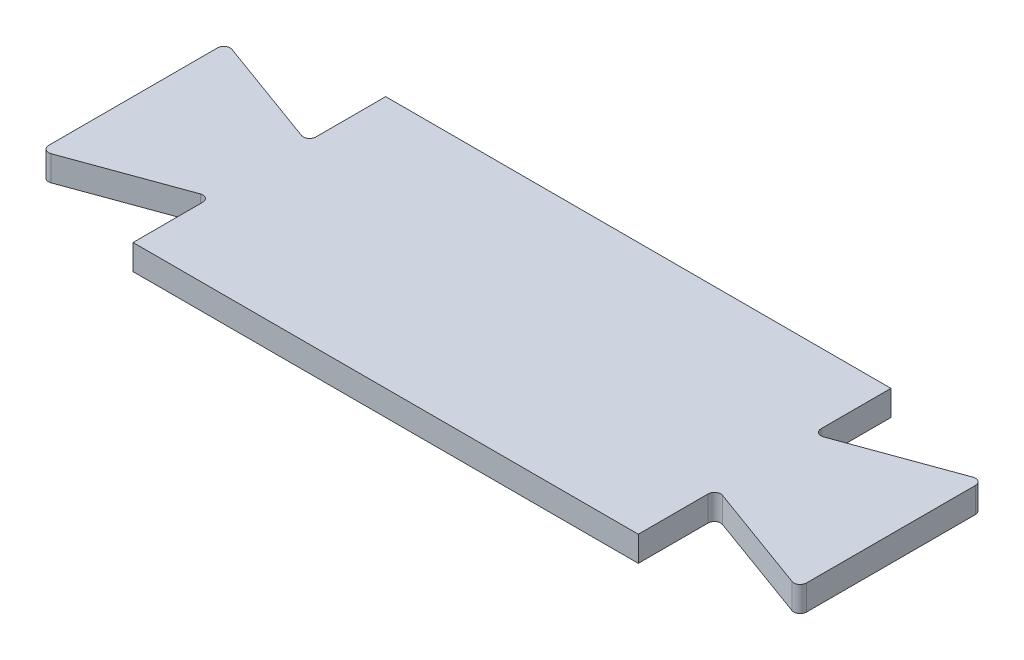
ISO-10303-21;
HEADER;
FILE_DESCRIPTION(('STEP AP214'),'2;1');
FILE_NAME('part.step','',(''),(''),'','','');
FILE_SCHEMA(('AUTOMOTIVE_DESIGN { 1 0 10303 214 1 1 1 1 }'));
ENDSEC;
DATA;
#1=APPLICATION_CONTEXT('core data for automotive mechanical design processes');
#2=APPLICATION_PROTOCOL_DEFINITION('international standard','automotive_design',2000,#1);
#3=PRODUCT_CONTEXT('',#1,'mechanical');
#4=PRODUCT('Part','Part','',(#3));
#5=PRODUCT_RELATED_PRODUCT_CATEGORY('part','',(#4));
#6=PRODUCT_DEFINITION_FORMATION('','',#4);
#7=PRODUCT_DEFINITION_CONTEXT('part definition',#1,'design');
#8=PRODUCT_DEFINITION('design','',#6,#7);
#9=PRODUCT_DEFINITION_SHAPE('','',#8);
#10=(LENGTH_UNIT() NAMED_UNIT(*) SI_UNIT(.MILLI.,.METRE.));
#11=(NAMED_UNIT(*) PLANE_ANGLE_UNIT() SI_UNIT($,.RADIAN.));
#12=(NAMED_UNIT(*) SI_UNIT($,.STERADIAN.) SOLID_ANGLE_UNIT());
#13=UNCERTAINTY_MEASURE_WITH_UNIT(LENGTH_MEASURE(1.E-05),#10,'distance_accuracy_value','');
#14=(GEOMETRIC_REPRESENTATION_CONTEXT(3) GLOBAL_UNCERTAINTY_ASSIGNED_CONTEXT((#13)) GLOBAL_UNIT_ASSIGNED_CONTEXT((#10,
#11,#12)) REPRESENTATION_CONTEXT('',''));
#15=CARTESIAN_POINT('',(0.,0.,0.));
#16=DIRECTION('',(0.,0.,1.));
#17=DIRECTION('',(1.,0.,0.));
#18=AXIS2_PLACEMENT_3D('',#15,#16,#17);
#19=CARTESIAN_POINT('',(10.,1.,-1.88014882866897));
#20=DIRECTION('',(-1.,0.,0.));
#21=DIRECTION('',(0.,0.,1.));
#22=AXIS2_PLACEMENT_3D('',#19,#20,#21);
#23=PLANE('',#22);
#24=DIRECTION('',(0.,0.,-1.));
#25=VECTOR('',#24,1.);
#26=CARTESIAN_POINT('',(10.,1.,-1.88014882866897));
#27=LINE('',#26,#25);
#28=CARTESIAN_POINT('',(10.,1.,-2.2371858303545));
#29=VERTEX_POINT('',#28);
#30=CARTESIAN_POINT('',(10.,1.,-5.));
#31=VERTEX_POINT('',#30);
#32=EDGE_CURVE('E169',#29,#31,#27,.T.);
#33=ORIENTED_EDGE('',*,*,#32,.F.);
#34=DIRECTION('',(0.,-1.,0.));
#35=VECTOR('',#34,1.);
#36=CARTESIAN_POINT('',(10.,0.,-2.2371858303545));
#37=LINE('',#36,#35);
#38=CARTESIAN_POINT('',(10.,0.,-2.2371858303545));
#39=VERTEX_POINT('',#38);
#40=EDGE_CURVE('E236',#29,#39,#37,.T.);
#41=ORIENTED_EDGE('',*,*,#40,.T.);
#42=DIRECTION('',(0.,0.,-1.));
#43=VECTOR('',#42,1.);
#44=CARTESIAN_POINT('',(10.,0.,-1.88014882866897));
#45=LINE('',#44,#43);
#46=CARTESIAN_POINT('',(10.,0.,-5.));
#47=VERTEX_POINT('',#46);
#48=EDGE_CURVE('E194',#39,#47,#45,.T.);
#49=ORIENTED_EDGE('',*,*,#48,.T.);
#50=DIRECTION('',(0.,-1.,0.));
#51=VECTOR('',#50,1.);
#52=CARTESIAN_POINT('',(10.,1.,-5.));
#53=LINE('',#52,#51);
#54=EDGE_CURVE('E187',#31,#47,#53,.T.);
#55=ORIENTED_EDGE('',*,*,#54,.F.);
#56=EDGE_LOOP('',(#33,#41,#49,#55));
#57=FACE_BOUND('',#56,.T.);
#58=ADVANCED_FACE('F33',(#57),#23,.F.);
#59=CARTESIAN_POINT('',(-10.,1.,-5.));
#60=DIRECTION('',(0.,0.,1.));
#61=DIRECTION('',(1.,0.,0.));
#62=AXIS2_PLACEMENT_3D('',#59,#60,#61);
#63=PLANE('',#62);
#64=DIRECTION('',(-1.,0.,0.));
#65=VECTOR('',#64,1.);
#66=CARTESIAN_POINT('',(-10.,0.,-5.));
#67=LINE('',#66,#65);
#68=CARTESIAN_POINT('',(-10.,0.,-5.));
#69=VERTEX_POINT('',#68);
#70=EDGE_CURVE('E305',#47,#69,#67,.T.);
#71=ORIENTED_EDGE('',*,*,#70,.T.);
#72=DIRECTION('',(0.,-1.,0.));
#73=VECTOR('',#72,1.);
#74=CARTESIAN_POINT('',(-10.,1.,-5.));
#75=LINE('',#74,#73);
#76=CARTESIAN_POINT('',(-10.,1.,-5.));
#77=VERTEX_POINT('',#76);
#78=EDGE_CURVE('E189',#77,#69,#75,.T.);
#79=ORIENTED_EDGE('',*,*,#78,.F.);
#80=DIRECTION('',(-1.,0.,0.));
#81=VECTOR('',#80,1.);
#82=CARTESIAN_POINT('',(-10.,1.,-5.));
#83=LINE('',#82,#81);
#84=EDGE_CURVE('E174',#31,#77,#83,.T.);
#85=ORIENTED_EDGE('',*,*,#84,.F.);
#86=ORIENTED_EDGE('',*,*,#54,.T.);
#87=EDGE_LOOP('',(#71,#79,#85,#86));
#88=FACE_BOUND('',#87,.T.);
#89=ADVANCED_FACE('F186',(#88),#63,.F.);
#90=CARTESIAN_POINT('',(-10.,1.,-1.88014882866897));
#91=DIRECTION('',(1.,0.,0.));
#92=DIRECTION('',(0.,0.,-1.));
#93=AXIS2_PLACEMENT_3D('',#90,#91,#92);
#94=PLANE('',#93);
#95=DIRECTION('',(0.,0.,1.));
#96=VECTOR('',#95,1.);
#97=CARTESIAN_POINT('',(-10.,0.,-1.88014882866897));
#98=LINE('',#97,#96);
#99=CARTESIAN_POINT('',(-10.,0.,-2.2371858303545));
#100=VERTEX_POINT('',#99);
#101=EDGE_CURVE('E307',#69,#100,#98,.T.);
#102=ORIENTED_EDGE('',*,*,#101,.T.);
#103=DIRECTION('',(0.,-1.,0.));
#104=VECTOR('',#103,1.);
#105=CARTESIAN_POINT('',(-10.,1.,-2.2371858303545));
#106=LINE('',#105,#104);
#107=CARTESIAN_POINT('',(-10.,1.,-2.2371858303545));
#108=VERTEX_POINT('',#107);
#109=EDGE_CURVE('E234',#100,#108,#106,.F.);
#110=ORIENTED_EDGE('',*,*,#109,.T.);
#111=DIRECTION('',(0.,0.,1.));
#112=VECTOR('',#111,1.);
#113=CARTESIAN_POINT('',(-10.,1.,-1.88014882866897));
#114=LINE('',#113,#112);
#115=EDGE_CURVE('E191',#77,#108,#114,.T.);
#116=ORIENTED_EDGE('',*,*,#115,.F.);
#117=ORIENTED_EDGE('',*,*,#78,.T.);
#118=EDGE_LOOP('',(#102,#110,#116,#117));
#119=FACE_BOUND('',#118,.T.);
#120=ADVANCED_FACE('F393',(#119),#94,.F.);
#121=CARTESIAN_POINT('',(-10.,1.,-1.88014882866897));
#122=DIRECTION('',(-0.342020143325673,0.,0.939692620785907));
#123=DIRECTION('',(0.939692620785907,0.,0.342020143325673));
#124=AXIS2_PLACEMENT_3D('',#121,#122,#123);
#125=PLANE('',#124);
#126=DIRECTION('',(-0.939692620785907,0.,-0.342020143325673));
#127=VECTOR('',#126,1.);
#128=CARTESIAN_POINT('',(-10.,0.,-1.88014882866897));
#129=LINE('',#128,#127);
#130=CARTESIAN_POINT('',(-10.3355050358314,0.,-2.00226267515802));
#131=VERTEX_POINT('',#130);
#132=CARTESIAN_POINT('',(-14.6644949641686,0.,-3.57788615351095));
#133=VERTEX_POINT('',#132);
#134=EDGE_CURVE('E310',#131,#133,#129,.T.);
#135=ORIENTED_EDGE('',*,*,#134,.T.);
#136=DIRECTION('',(0.,-1.,0.));
#137=VECTOR('',#136,1.);
#138=CARTESIAN_POINT('',(-14.6644949641686,1.,-3.57788615351095));
#139=LINE('',#138,#137);
#140=CARTESIAN_POINT('',(-14.6644949641686,1.,-3.57788615351095));
#141=VERTEX_POINT('',#140);
#142=EDGE_CURVE('E232',#133,#141,#139,.F.);
#143=ORIENTED_EDGE('',*,*,#142,.T.);
#144=DIRECTION('',(-0.939692620785907,0.,-0.342020143325673));
#145=VECTOR('',#144,1.);
#146=CARTESIAN_POINT('',(-10.,1.,-1.88014882866897));
#147=LINE('',#146,#145);
#148=CARTESIAN_POINT('',(-10.3355050358314,1.,-2.00226267515802));
#149=VERTEX_POINT('',#148);
#150=EDGE_CURVE('E352',#149,#141,#147,.T.);
#151=ORIENTED_EDGE('',*,*,#150,.F.);
#152=DIRECTION('',(0.,-1.,0.));
#153=VECTOR('',#152,1.);
#154=CARTESIAN_POINT('',(-10.3355050358314,0.,-2.00226267515802));
#155=LINE('',#154,#153);
#156=EDGE_CURVE('E229',#149,#131,#155,.T.);
#157=ORIENTED_EDGE('',*,*,#156,.T.);
#158=EDGE_LOOP('',(#135,#143,#151,#157));
#159=FACE_BOUND('',#158,.T.);
#160=ADVANCED_FACE('F366',(#159),#125,.F.);
#161=CARTESIAN_POINT('',(-15.,1.,-3.7));
#162=DIRECTION('',(1.,0.,0.));
#163=DIRECTION('',(0.,0.,-1.));
#164=AXIS2_PLACEMENT_3D('',#161,#162,#163);
#165=PLANE('',#164);
#166=DIRECTION('',(0.,0.,1.));
#167=VECTOR('',#166,1.);
#168=CARTESIAN_POINT('',(-15.,0.,-3.7));
#169=LINE('',#168,#167);
#170=CARTESIAN_POINT('',(-15.,0.,-3.34296299831447));
#171=VERTEX_POINT('',#170);
#172=CARTESIAN_POINT('',(-15.,0.,3.34296299831447));
#173=VERTEX_POINT('',#172);
#174=EDGE_CURVE('E313',#171,#173,#169,.T.);
#175=ORIENTED_EDGE('',*,*,#174,.T.);
#176=DIRECTION('',(0.,-1.,0.));
#177=VECTOR('',#176,1.);
#178=CARTESIAN_POINT('',(-15.,1.,3.34296299831447));
#179=LINE('',#178,#177);
#180=CARTESIAN_POINT('',(-15.,1.,3.34296299831447));
#181=VERTEX_POINT('',#180);
#182=EDGE_CURVE('E220',#173,#181,#179,.F.);
#183=ORIENTED_EDGE('',*,*,#182,.T.);
#184=DIRECTION('',(0.,0.,1.));
#185=VECTOR('',#184,1.);
#186=CARTESIAN_POINT('',(-15.,1.,-3.7));
#187=LINE('',#186,#185);
#188=CARTESIAN_POINT('',(-15.,1.,-3.34296299831447));
#189=VERTEX_POINT('',#188);
#190=EDGE_CURVE('E349',#189,#181,#187,.T.);
#191=ORIENTED_EDGE('',*,*,#190,.F.);
#192=DIRECTION('',(0.,-1.,0.));
#193=VECTOR('',#192,1.);
#194=CARTESIAN_POINT('',(-15.,1.,-3.34296299831447));
#195=LINE('',#194,#193);
#196=EDGE_CURVE('E217',#189,#171,#195,.T.);
#197=ORIENTED_EDGE('',*,*,#196,.T.);
#198=EDGE_LOOP('',(#175,#183,#191,#197));
#199=FACE_BOUND('',#198,.T.);
#200=ADVANCED_FACE('F376',(#199),#165,.F.);
#201=CARTESIAN_POINT('',(-10.,1.,1.88014882866896));
#202=DIRECTION('',(-0.342020143325673,0.,-0.939692620785907));
#203=DIRECTION('',(-0.939692620785907,0.,0.342020143325673));
#204=AXIS2_PLACEMENT_3D('',#201,#202,#203);
#205=PLANE('',#204);
#206=DIRECTION('',(0.939692620785907,0.,-0.342020143325673));
#207=VECTOR('',#206,1.);
#208=CARTESIAN_POINT('',(-10.,0.,1.88014882866896));
#209=LINE('',#208,#207);
#210=CARTESIAN_POINT('',(-14.6644949641686,0.,3.57788615351095));
#211=VERTEX_POINT('',#210);
#212=CARTESIAN_POINT('',(-10.3355050358314,0.,2.00226267515802));
#213=VERTEX_POINT('',#212);
#214=EDGE_CURVE('E316',#211,#213,#209,.T.);
#215=ORIENTED_EDGE('',*,*,#214,.T.);
#216=DIRECTION('',(0.,-1.,0.));
#217=VECTOR('',#216,1.);
#218=CARTESIAN_POINT('',(-10.3355050358314,1.,2.00226267515802));
#219=LINE('',#218,#217);
#220=CARTESIAN_POINT('',(-10.3355050358314,1.,2.00226267515802));
#221=VERTEX_POINT('',#220);
#222=EDGE_CURVE('E207',#213,#221,#219,.F.);
#223=ORIENTED_EDGE('',*,*,#222,.T.);
#224=DIRECTION('',(0.939692620785907,0.,-0.342020143325673));
#225=VECTOR('',#224,1.);
#226=CARTESIAN_POINT('',(-10.,1.,1.88014882866896));
#227=LINE('',#226,#225);
#228=CARTESIAN_POINT('',(-14.6644949641686,1.,3.57788615351095));
#229=VERTEX_POINT('',#228);
#230=EDGE_CURVE('E346',#229,#221,#227,.T.);
#231=ORIENTED_EDGE('',*,*,#230,.F.);
#232=DIRECTION('',(0.,-1.,0.));
#233=VECTOR('',#232,1.);
#234=CARTESIAN_POINT('',(-14.6644949641686,1.,3.57788615351095));
#235=LINE('',#234,#233);
#236=EDGE_CURVE('E199',#229,#211,#235,.T.);
#237=ORIENTED_EDGE('',*,*,#236,.T.);
#238=EDGE_LOOP('',(#215,#223,#231,#237));
#239=FACE_BOUND('',#238,.T.);
#240=ADVANCED_FACE('F345',(#239),#205,.F.);
#241=CARTESIAN_POINT('',(-10.,1.,5.));
#242=DIRECTION('',(1.,0.,0.));
#243=DIRECTION('',(0.,0.,-1.));
#244=AXIS2_PLACEMENT_3D('',#241,#242,#243);
#245=PLANE('',#244);
#246=DIRECTION('',(0.,0.,1.));
#247=VECTOR('',#246,1.);
#248=CARTESIAN_POINT('',(-10.,1.,5.));
#249=LINE('',#248,#247);
#250=CARTESIAN_POINT('',(-10.,1.,2.23718583035449));
#251=VERTEX_POINT('',#250);
#252=CARTESIAN_POINT('',(-10.,1.,5.));
#253=VERTEX_POINT('',#252);
#254=EDGE_CURVE('E337',#251,#253,#249,.T.);
#255=ORIENTED_EDGE('',*,*,#254,.F.);
#256=DIRECTION('',(0.,-1.,0.));
#257=VECTOR('',#256,1.);
#258=CARTESIAN_POINT('',(-10.,0.,2.23718583035449));
#259=LINE('',#258,#257);
#260=CARTESIAN_POINT('',(-10.,0.,2.23718583035449));
#261=VERTEX_POINT('',#260);
#262=EDGE_CURVE('E196',#251,#261,#259,.T.);
#263=ORIENTED_EDGE('',*,*,#262,.T.);
#264=DIRECTION('',(0.,0.,1.));
#265=VECTOR('',#264,1.);
#266=CARTESIAN_POINT('',(-10.,0.,5.));
#267=LINE('',#266,#265);
#268=CARTESIAN_POINT('',(-10.,0.,5.));
#269=VERTEX_POINT('',#268);
#270=EDGE_CURVE('E319',#261,#269,#267,.T.);
#271=ORIENTED_EDGE('',*,*,#270,.T.);
#272=DIRECTION('',(0.,-1.,0.));
#273=VECTOR('',#272,1.);
#274=CARTESIAN_POINT('',(-10.,1.,5.));
#275=LINE('',#274,#273);
#276=EDGE_CURVE('E201',#253,#269,#275,.T.);
#277=ORIENTED_EDGE('',*,*,#276,.F.);
#278=EDGE_LOOP('',(#255,#263,#271,#277));
#279=FACE_BOUND('',#278,.T.);
#280=ADVANCED_FACE('F335',(#279),#245,.F.);
#281=CARTESIAN_POINT('',(-10.,1.,5.));
#282=DIRECTION('',(0.,0.,-1.));
#283=DIRECTION('',(-1.,0.,0.));
#284=AXIS2_PLACEMENT_3D('',#281,#282,#283);
#285=PLANE('',#284);
#286=DIRECTION('',(1.,0.,0.));
#287=VECTOR('',#286,1.);
#288=CARTESIAN_POINT('',(-10.,0.,5.));
#289=LINE('',#288,#287);
#290=CARTESIAN_POINT('',(10.,0.,5.));
#291=VERTEX_POINT('',#290);
#292=EDGE_CURVE('E284',#269,#291,#289,.T.);
#293=ORIENTED_EDGE('',*,*,#292,.T.);
#294=DIRECTION('',(0.,-1.,0.));
#295=VECTOR('',#294,1.);
#296=CARTESIAN_POINT('',(10.,1.,5.));
#297=LINE('',#296,#295);
#298=CARTESIAN_POINT('',(10.,1.,5.));
#299=VERTEX_POINT('',#298);
#300=EDGE_CURVE('E283',#299,#291,#297,.T.);
#301=ORIENTED_EDGE('',*,*,#300,.F.);
#302=DIRECTION('',(1.,0.,0.));
#303=VECTOR('',#302,1.);
#304=CARTESIAN_POINT('',(-10.,1.,5.));
#305=LINE('',#304,#303);
#306=EDGE_CURVE('E299',#253,#299,#305,.T.);
#307=ORIENTED_EDGE('',*,*,#306,.F.);
#308=ORIENTED_EDGE('',*,*,#276,.T.);
#309=EDGE_LOOP('',(#293,#301,#307,#308));
#310=FACE_BOUND('',#309,.T.);
#311=ADVANCED_FACE('F331',(#310),#285,.F.);
#312=CARTESIAN_POINT('',(10.,1.,5.));
#313=DIRECTION('',(-1.,0.,0.));
#314=DIRECTION('',(0.,0.,1.));
#315=AXIS2_PLACEMENT_3D('',#312,#313,#314);
#316=PLANE('',#315);
#317=DIRECTION('',(0.,0.,-1.));
#318=VECTOR('',#317,1.);
#319=CARTESIAN_POINT('',(10.,0.,5.));
#320=LINE('',#319,#318);
#321=CARTESIAN_POINT('',(10.,0.,2.23718583035449));
#322=VERTEX_POINT('',#321);
#323=EDGE_CURVE('E271',#291,#322,#320,.T.);
#324=ORIENTED_EDGE('',*,*,#323,.T.);
#325=DIRECTION('',(0.,-1.,0.));
#326=VECTOR('',#325,1.);
#327=CARTESIAN_POINT('',(10.,1.,2.23718583035449));
#328=LINE('',#327,#326);
#329=CARTESIAN_POINT('',(10.,1.,2.23718583035449));
#330=VERTEX_POINT('',#329);
#331=EDGE_CURVE('E252',#322,#330,#328,.F.);
#332=ORIENTED_EDGE('',*,*,#331,.T.);
#333=DIRECTION('',(0.,0.,-1.));
#334=VECTOR('',#333,1.);
#335=CARTESIAN_POINT('',(10.,1.,5.));
#336=LINE('',#335,#334);
#337=EDGE_CURVE('E291',#299,#330,#336,.T.);
#338=ORIENTED_EDGE('',*,*,#337,.F.);
#339=ORIENTED_EDGE('',*,*,#300,.T.);
#340=EDGE_LOOP('',(#324,#332,#338,#339));
#341=FACE_BOUND('',#340,.T.);
#342=ADVANCED_FACE('F279',(#341),#316,.F.);
#343=CARTESIAN_POINT('',(10.,1.,1.88014882866896));
#344=DIRECTION('',(0.342020143325672,0.,-0.939692620785907));
#345=DIRECTION('',(-0.939692620785907,0.,-0.342020143325672));
#346=AXIS2_PLACEMENT_3D('',#343,#344,#345);
#347=PLANE('',#346);
#348=DIRECTION('',(0.939692620785907,0.,0.342020143325672));
#349=VECTOR('',#348,1.);
#350=CARTESIAN_POINT('',(10.,0.,1.88014882866896));
#351=LINE('',#350,#349);
#352=CARTESIAN_POINT('',(10.3355050358314,0.,2.00226267515801));
#353=VERTEX_POINT('',#352);
#354=CARTESIAN_POINT('',(14.6644949641686,0.,3.57788615351094));
#355=VERTEX_POINT('',#354);
#356=EDGE_CURVE('E273',#353,#355,#351,.T.);
#357=ORIENTED_EDGE('',*,*,#356,.T.);
#358=DIRECTION('',(0.,-1.,0.));
#359=VECTOR('',#358,1.);
#360=CARTESIAN_POINT('',(14.6644949641686,1.,3.57788615351094));
#361=LINE('',#360,#359);
#362=CARTESIAN_POINT('',(14.6644949641686,1.,3.57788615351094));
#363=VERTEX_POINT('',#362);
#364=EDGE_CURVE('E250',#355,#363,#361,.F.);
#365=ORIENTED_EDGE('',*,*,#364,.T.);
#366=DIRECTION('',(0.939692620785907,0.,0.342020143325672));
#367=VECTOR('',#366,1.);
#368=CARTESIAN_POINT('',(10.,1.,1.88014882866896));
#369=LINE('',#368,#367);
#370=CARTESIAN_POINT('',(10.3355050358314,1.,2.00226267515801));
#371=VERTEX_POINT('',#370);
#372=EDGE_CURVE('E289',#371,#363,#369,.T.);
#373=ORIENTED_EDGE('',*,*,#372,.F.);
#374=DIRECTION('',(0.,-1.,0.));
#375=VECTOR('',#374,1.);
#376=CARTESIAN_POINT('',(10.3355050358314,0.,2.00226267515801));
#377=LINE('',#376,#375);
#378=EDGE_CURVE('E247',#371,#353,#377,.T.);
#379=ORIENTED_EDGE('',*,*,#378,.T.);
#380=EDGE_LOOP('',(#357,#365,#373,#379));
#381=FACE_BOUND('',#380,.T.);
#382=ADVANCED_FACE('F293',(#381),#347,.F.);
#383=CARTESIAN_POINT('',(15.,1.,-3.70000000000001));
#384=DIRECTION('',(-1.,0.,0.));
#385=DIRECTION('',(0.,0.,1.));
#386=AXIS2_PLACEMENT_3D('',#383,#384,#385);
#387=PLANE('',#386);
#388=DIRECTION('',(0.,0.,-1.));
#389=VECTOR('',#388,1.);
#390=CARTESIAN_POINT('',(15.,0.,-3.70000000000001));
#391=LINE('',#390,#389);
#392=CARTESIAN_POINT('',(15.,0.,3.34296299831446));
#393=VERTEX_POINT('',#392);
#394=CARTESIAN_POINT('',(15.,0.,-3.34296299831448));
#395=VERTEX_POINT('',#394);
#396=EDGE_CURVE('E323',#393,#395,#391,.T.);
#397=ORIENTED_EDGE('',*,*,#396,.T.);
#398=DIRECTION('',(0.,-1.,0.));
#399=VECTOR('',#398,1.);
#400=CARTESIAN_POINT('',(15.,1.,-3.34296299831448));
#401=LINE('',#400,#399);
#402=CARTESIAN_POINT('',(15.,1.,-3.34296299831448));
#403=VERTEX_POINT('',#402);
#404=EDGE_CURVE('E245',#395,#403,#401,.F.);
#405=ORIENTED_EDGE('',*,*,#404,.T.);
#406=DIRECTION('',(0.,0.,-1.));
#407=VECTOR('',#406,1.);
#408=CARTESIAN_POINT('',(15.,1.,-3.70000000000001));
#409=LINE('',#408,#407);
#410=CARTESIAN_POINT('',(15.,1.,3.34296299831446));
#411=VERTEX_POINT('',#410);
#412=EDGE_CURVE('E295',#411,#403,#409,.T.);
#413=ORIENTED_EDGE('',*,*,#412,.F.);
#414=DIRECTION('',(0.,-1.,0.));
#415=VECTOR('',#414,1.);
#416=CARTESIAN_POINT('',(15.,1.,3.34296299831446));
#417=LINE('',#416,#415);
#418=EDGE_CURVE('E242',#411,#393,#417,.T.);
#419=ORIENTED_EDGE('',*,*,#418,.T.);
#420=EDGE_LOOP('',(#397,#405,#413,#419));
#421=FACE_BOUND('',#420,.T.);
#422=ADVANCED_FACE('F412',(#421),#387,.F.);
#423=CARTESIAN_POINT('',(10.,1.,-1.88014882866897));
#424=DIRECTION('',(0.342020143325673,0.,0.939692620785907));
#425=DIRECTION('',(0.939692620785907,0.,-0.342020143325673));
#426=AXIS2_PLACEMENT_3D('',#423,#424,#425);
#427=PLANE('',#426);
#428=DIRECTION('',(-0.939692620785907,0.,0.342020143325673));
#429=VECTOR('',#428,1.);
#430=CARTESIAN_POINT('',(10.,0.,-1.88014882866897));
#431=LINE('',#430,#429);
#432=CARTESIAN_POINT('',(14.6644949641686,0.,-3.57788615351096));
#433=VERTEX_POINT('',#432);
#434=CARTESIAN_POINT('',(10.3355050358314,0.,-2.00226267515803));
#435=VERTEX_POINT('',#434);
#436=EDGE_CURVE('E182',#433,#435,#431,.T.);
#437=ORIENTED_EDGE('',*,*,#436,.T.);
#438=DIRECTION('',(0.,-1.,0.));
#439=VECTOR('',#438,1.);
#440=CARTESIAN_POINT('',(10.3355050358314,1.,-2.00226267515803));
#441=LINE('',#440,#439);
#442=CARTESIAN_POINT('',(10.3355050358314,1.,-2.00226267515803));
#443=VERTEX_POINT('',#442);
#444=EDGE_CURVE('E48',#435,#443,#441,.F.);
#445=ORIENTED_EDGE('',*,*,#444,.T.);
#446=DIRECTION('',(-0.939692620785907,0.,0.342020143325673));
#447=VECTOR('',#446,1.);
#448=CARTESIAN_POINT('',(10.,1.,-1.88014882866897));
#449=LINE('',#448,#447);
#450=CARTESIAN_POINT('',(14.6644949641686,1.,-3.57788615351096));
#451=VERTEX_POINT('',#450);
#452=EDGE_CURVE('E297',#451,#443,#449,.T.);
#453=ORIENTED_EDGE('',*,*,#452,.F.);
#454=DIRECTION('',(0.,-1.,0.));
#455=VECTOR('',#454,1.);
#456=CARTESIAN_POINT('',(14.6644949641686,1.,-3.57788615351096));
#457=LINE('',#456,#455);
#458=EDGE_CURVE('E238',#451,#433,#457,.T.);
#459=ORIENTED_EDGE('',*,*,#458,.T.);
#460=EDGE_LOOP('',(#437,#445,#453,#459));
#461=FACE_BOUND('',#460,.T.);
#462=ADVANCED_FACE('F415',(#461),#427,.F.);
#463=CARTESIAN_POINT('',(0.,1.,0.));
#464=DIRECTION('',(0.,-1.,0.));
#465=DIRECTION('',(0.,0.,-1.));
#466=AXIS2_PLACEMENT_3D('',#463,#464,#465);
#467=PLANE('',#466);
#468=ORIENTED_EDGE('',*,*,#190,.T.);
#469=CARTESIAN_POINT('',(-14.75,1.,3.34296299831447));
#470=DIRECTION('',(0.,-1.,0.));
#471=DIRECTION('',(0.,0.,-1.));
#472=AXIS2_PLACEMENT_3D('',#469,#470,#471);
#473=CIRCLE('',#472,0.25);
#474=EDGE_CURVE('E227',#181,#229,#473,.F.);
#475=ORIENTED_EDGE('',*,*,#474,.T.);
#476=ORIENTED_EDGE('',*,*,#230,.T.);
#477=CARTESIAN_POINT('',(-10.25,1.,2.23718583035449));
#478=DIRECTION('',(0.,-1.,0.));
#479=DIRECTION('',(0.,0.,-1.));
#480=AXIS2_PLACEMENT_3D('',#477,#478,#479);
#481=CIRCLE('',#480,0.25);
#482=EDGE_CURVE('E256',#221,#251,#481,.T.);
#483=ORIENTED_EDGE('',*,*,#482,.T.);
#484=ORIENTED_EDGE('',*,*,#254,.T.);
#485=ORIENTED_EDGE('',*,*,#306,.T.);
#486=ORIENTED_EDGE('',*,*,#337,.T.);
#487=CARTESIAN_POINT('',(10.25,1.,2.23718583035449));
#488=DIRECTION('',(0.,-1.,0.));
#489=DIRECTION('',(0.,0.,-1.));
#490=AXIS2_PLACEMENT_3D('',#487,#488,#489);
#491=CIRCLE('',#490,0.25);
#492=EDGE_CURVE('E11',#330,#371,#491,.T.);
#493=ORIENTED_EDGE('',*,*,#492,.T.);
#494=ORIENTED_EDGE('',*,*,#372,.T.);
#495=CARTESIAN_POINT('',(14.75,1.,3.34296299831446));
#496=DIRECTION('',(0.,-1.,0.));
#497=DIRECTION('',(0.,0.,-1.));
#498=AXIS2_PLACEMENT_3D('',#495,#496,#497);
#499=CIRCLE('',#498,0.25);
#500=EDGE_CURVE('E222',#363,#411,#499,.F.);
#501=ORIENTED_EDGE('',*,*,#500,.T.);
#502=ORIENTED_EDGE('',*,*,#412,.T.);
#503=CARTESIAN_POINT('',(14.75,1.,-3.34296299831448));
#504=DIRECTION('',(0.,-1.,0.));
#505=DIRECTION('',(0.,0.,-1.));
#506=AXIS2_PLACEMENT_3D('',#503,#504,#505);
#507=CIRCLE('',#506,0.25);
#508=EDGE_CURVE('E55',#403,#451,#507,.F.);
#509=ORIENTED_EDGE('',*,*,#508,.T.);
#510=ORIENTED_EDGE('',*,*,#452,.T.);
#511=CARTESIAN_POINT('',(10.25,1.,-2.2371858303545));
#512=DIRECTION('',(0.,-1.,0.));
#513=DIRECTION('',(0.,0.,-1.));
#514=AXIS2_PLACEMENT_3D('',#511,#512,#513);
#515=CIRCLE('',#514,0.25);
#516=EDGE_CURVE('E177',#443,#29,#515,.T.);
#517=ORIENTED_EDGE('',*,*,#516,.T.);
#518=ORIENTED_EDGE('',*,*,#32,.T.);
#519=ORIENTED_EDGE('',*,*,#84,.T.);
#520=ORIENTED_EDGE('',*,*,#115,.T.);
#521=CARTESIAN_POINT('',(-10.25,1.,-2.2371858303545));
#522=DIRECTION('',(0.,-1.,0.));
#523=DIRECTION('',(0.,0.,-1.));
#524=AXIS2_PLACEMENT_3D('',#521,#522,#523);
#525=CIRCLE('',#524,0.25);
#526=EDGE_CURVE('E260',#108,#149,#525,.T.);
#527=ORIENTED_EDGE('',*,*,#526,.T.);
#528=ORIENTED_EDGE('',*,*,#150,.T.);
#529=CARTESIAN_POINT('',(-14.75,1.,-3.34296299831447));
#530=DIRECTION('',(0.,-1.,0.));
#531=DIRECTION('',(0.,0.,-1.));
#532=AXIS2_PLACEMENT_3D('',#529,#530,#531);
#533=CIRCLE('',#532,0.25);
#534=EDGE_CURVE('E225',#141,#189,#533,.F.);
#535=ORIENTED_EDGE('',*,*,#534,.T.);
#536=EDGE_LOOP('',(#468,#475,#476,#483,#484,#485,#486,#493,#494,#501,#502,#509,#510,#517,#518,
#519,#520,#527,#528,#535));
#537=FACE_BOUND('',#536,.T.);
#538=ADVANCED_FACE('F172',(#537),#467,.F.);
#539=CARTESIAN_POINT('',(0.,0.,0.));
#540=DIRECTION('',(0.,-1.,0.));
#541=DIRECTION('',(0.,0.,-1.));
#542=AXIS2_PLACEMENT_3D('',#539,#540,#541);
#543=PLANE('',#542);
#544=ORIENTED_EDGE('',*,*,#214,.F.);
#545=CARTESIAN_POINT('',(-14.75,0.,3.34296299831447));
#546=DIRECTION('',(0.,-1.,0.));
#547=DIRECTION('',(0.,0.,-1.));
#548=AXIS2_PLACEMENT_3D('',#545,#546,#547);
#549=CIRCLE('',#548,0.25);
#550=EDGE_CURVE('E215',#211,#173,#549,.T.);
#551=ORIENTED_EDGE('',*,*,#550,.T.);
#552=ORIENTED_EDGE('',*,*,#174,.F.);
#553=CARTESIAN_POINT('',(-14.75,0.,-3.34296299831447));
#554=DIRECTION('',(0.,-1.,0.));
#555=DIRECTION('',(0.,0.,-1.));
#556=AXIS2_PLACEMENT_3D('',#553,#554,#555);
#557=CIRCLE('',#556,0.25);
#558=EDGE_CURVE('E213',#171,#133,#557,.T.);
#559=ORIENTED_EDGE('',*,*,#558,.T.);
#560=ORIENTED_EDGE('',*,*,#134,.F.);
#561=CARTESIAN_POINT('',(-10.25,0.,-2.2371858303545));
#562=DIRECTION('',(0.,-1.,0.));
#563=DIRECTION('',(0.,0.,-1.));
#564=AXIS2_PLACEMENT_3D('',#561,#562,#563);
#565=CIRCLE('',#564,0.25);
#566=EDGE_CURVE('E258',#131,#100,#565,.F.);
#567=ORIENTED_EDGE('',*,*,#566,.T.);
#568=ORIENTED_EDGE('',*,*,#101,.F.);
#569=ORIENTED_EDGE('',*,*,#70,.F.);
#570=ORIENTED_EDGE('',*,*,#48,.F.);
#571=CARTESIAN_POINT('',(10.25,0.,-2.2371858303545));
#572=DIRECTION('',(0.,-1.,0.));
#573=DIRECTION('',(0.,0.,-1.));
#574=AXIS2_PLACEMENT_3D('',#571,#572,#573);
#575=CIRCLE('',#574,0.25);
#576=EDGE_CURVE('E262',#39,#435,#575,.F.);
#577=ORIENTED_EDGE('',*,*,#576,.T.);
#578=ORIENTED_EDGE('',*,*,#436,.F.);
#579=CARTESIAN_POINT('',(14.75,0.,-3.34296299831448));
#580=DIRECTION('',(0.,-1.,0.));
#581=DIRECTION('',(0.,0.,-1.));
#582=AXIS2_PLACEMENT_3D('',#579,#580,#581);
#583=CIRCLE('',#582,0.25);
#584=EDGE_CURVE('E211',#433,#395,#583,.T.);
#585=ORIENTED_EDGE('',*,*,#584,.T.);
#586=ORIENTED_EDGE('',*,*,#396,.F.);
#587=CARTESIAN_POINT('',(14.75,0.,3.34296299831446));
#588=DIRECTION('',(0.,-1.,0.));
#589=DIRECTION('',(0.,0.,-1.));
#590=AXIS2_PLACEMENT_3D('',#587,#588,#589);
#591=CIRCLE('',#590,0.25);
#592=EDGE_CURVE('E209',#393,#355,#591,.T.);
#593=ORIENTED_EDGE('',*,*,#592,.T.);
#594=ORIENTED_EDGE('',*,*,#356,.F.);
#595=CARTESIAN_POINT('',(10.25,0.,2.23718583035449));
#596=DIRECTION('',(0.,-1.,0.));
#597=DIRECTION('',(0.,0.,-1.));
#598=AXIS2_PLACEMENT_3D('',#595,#596,#597);
#599=CIRCLE('',#598,0.25);
#600=EDGE_CURVE('E41',#353,#322,#599,.F.);
#601=ORIENTED_EDGE('',*,*,#600,.T.);
#602=ORIENTED_EDGE('',*,*,#323,.F.);
#603=ORIENTED_EDGE('',*,*,#292,.F.);
#604=ORIENTED_EDGE('',*,*,#270,.F.);
#605=CARTESIAN_POINT('',(-10.25,0.,2.23718583035449));
#606=DIRECTION('',(0.,-1.,0.));
#607=DIRECTION('',(0.,0.,-1.));
#608=AXIS2_PLACEMENT_3D('',#605,#606,#607);
#609=CIRCLE('',#608,0.25);
#610=EDGE_CURVE('E254',#261,#213,#609,.F.);
#611=ORIENTED_EDGE('',*,*,#610,.T.);
#612=EDGE_LOOP('',(#544,#551,#552,#559,#560,#567,#568,#569,#570,#577,#578,#585,#586,#593,#594,
#601,#602,#603,#604,#611));
#613=FACE_BOUND('',#612,.T.);
#614=ADVANCED_FACE('F269',(#613),#543,.T.);
#615=CARTESIAN_POINT('',(-10.25,1.,2.23718583035449));
#616=DIRECTION('',(0.,1.,0.));
#617=DIRECTION('',(0.,0.,1.));
#618=AXIS2_PLACEMENT_3D('',#615,#616,#617);
#619=CYLINDRICAL_SURFACE('',#618,0.25);
#620=ORIENTED_EDGE('',*,*,#482,.F.);
#621=ORIENTED_EDGE('',*,*,#222,.F.);
#622=ORIENTED_EDGE('',*,*,#610,.F.);
#623=ORIENTED_EDGE('',*,*,#262,.F.);
#624=EDGE_LOOP('',(#620,#621,#622,#623));
#625=FACE_BOUND('',#624,.T.);
#626=ADVANCED_FACE('F340',(#625),#619,.F.);
#627=CARTESIAN_POINT('',(-14.75,1.,3.34296299831447));
#628=DIRECTION('',(0.,-1.,0.));
#629=DIRECTION('',(0.,0.,-1.));
#630=AXIS2_PLACEMENT_3D('',#627,#628,#629);
#631=CYLINDRICAL_SURFACE('',#630,0.25);
#632=ORIENTED_EDGE('',*,*,#474,.F.);
#633=ORIENTED_EDGE('',*,*,#182,.F.);
#634=ORIENTED_EDGE('',*,*,#550,.F.);
#635=ORIENTED_EDGE('',*,*,#236,.F.);
#636=EDGE_LOOP('',(#632,#633,#634,#635));
#637=FACE_BOUND('',#636,.T.);
#638=ADVANCED_FACE('F379',(#637),#631,.T.);
#639=CARTESIAN_POINT('',(-14.75,1.,-3.34296299831447));
#640=DIRECTION('',(0.,-1.,0.));
#641=DIRECTION('',(0.,0.,-1.));
#642=AXIS2_PLACEMENT_3D('',#639,#640,#641);
#643=CYLINDRICAL_SURFACE('',#642,0.25);
#644=ORIENTED_EDGE('',*,*,#534,.F.);
#645=ORIENTED_EDGE('',*,*,#142,.F.);
#646=ORIENTED_EDGE('',*,*,#558,.F.);
#647=ORIENTED_EDGE('',*,*,#196,.F.);
#648=EDGE_LOOP('',(#644,#645,#646,#647));
#649=FACE_BOUND('',#648,.T.);
#650=ADVANCED_FACE('F373',(#649),#643,.T.);
#651=CARTESIAN_POINT('',(-10.25,1.,-2.2371858303545));
#652=DIRECTION('',(0.,1.,0.));
#653=DIRECTION('',(0.,0.,1.));
#654=AXIS2_PLACEMENT_3D('',#651,#652,#653);
#655=CYLINDRICAL_SURFACE('',#654,0.25);
#656=ORIENTED_EDGE('',*,*,#526,.F.);
#657=ORIENTED_EDGE('',*,*,#109,.F.);
#658=ORIENTED_EDGE('',*,*,#566,.F.);
#659=ORIENTED_EDGE('',*,*,#156,.F.);
#660=EDGE_LOOP('',(#656,#657,#658,#659));
#661=FACE_BOUND('',#660,.T.);
#662=ADVANCED_FACE('F363',(#661),#655,.F.);
#663=CARTESIAN_POINT('',(10.25,1.,-2.2371858303545));
#664=DIRECTION('',(0.,1.,0.));
#665=DIRECTION('',(0.,0.,1.));
#666=AXIS2_PLACEMENT_3D('',#663,#664,#665);
#667=CYLINDRICAL_SURFACE('',#666,0.25);
#668=ORIENTED_EDGE('',*,*,#516,.F.);
#669=ORIENTED_EDGE('',*,*,#444,.F.);
#670=ORIENTED_EDGE('',*,*,#576,.F.);
#671=ORIENTED_EDGE('',*,*,#40,.F.);
#672=EDGE_LOOP('',(#668,#669,#670,#671));
#673=FACE_BOUND('',#672,.T.);
#674=ADVANCED_FACE('F453',(#673),#667,.F.);
#675=CARTESIAN_POINT('',(14.75,1.,-3.34296299831448));
#676=DIRECTION('',(0.,-1.,0.));
#677=DIRECTION('',(0.,0.,-1.));
#678=AXIS2_PLACEMENT_3D('',#675,#676,#677);
#679=CYLINDRICAL_SURFACE('',#678,0.25);
#680=ORIENTED_EDGE('',*,*,#508,.F.);
#681=ORIENTED_EDGE('',*,*,#404,.F.);
#682=ORIENTED_EDGE('',*,*,#584,.F.);
#683=ORIENTED_EDGE('',*,*,#458,.F.);
#684=EDGE_LOOP('',(#680,#681,#682,#683));
#685=FACE_BOUND('',#684,.T.);
#686=ADVANCED_FACE('F462',(#685),#679,.T.);
#687=CARTESIAN_POINT('',(14.75,1.,3.34296299831446));
#688=DIRECTION('',(0.,-1.,0.));
#689=DIRECTION('',(0.,0.,-1.));
#690=AXIS2_PLACEMENT_3D('',#687,#688,#689);
#691=CYLINDRICAL_SURFACE('',#690,0.25);
#692=ORIENTED_EDGE('',*,*,#500,.F.);
#693=ORIENTED_EDGE('',*,*,#364,.F.);
#694=ORIENTED_EDGE('',*,*,#592,.F.);
#695=ORIENTED_EDGE('',*,*,#418,.F.);
#696=EDGE_LOOP('',(#692,#693,#694,#695));
#697=FACE_BOUND('',#696,.T.);
#698=ADVANCED_FACE('F472',(#697),#691,.T.);
#699=CARTESIAN_POINT('',(10.25,1.,2.23718583035449));
#700=DIRECTION('',(0.,1.,0.));
#701=DIRECTION('',(0.,0.,1.));
#702=AXIS2_PLACEMENT_3D('',#699,#700,#701);
#703=CYLINDRICAL_SURFACE('',#702,0.25);
#704=ORIENTED_EDGE('',*,*,#492,.F.);
#705=ORIENTED_EDGE('',*,*,#331,.F.);
#706=ORIENTED_EDGE('',*,*,#600,.F.);
#707=ORIENTED_EDGE('',*,*,#378,.F.);
#708=EDGE_LOOP('',(#704,#705,#706,#707));
#709=FACE_BOUND('',#708,.T.);
#710=ADVANCED_FACE('F35',(#709),#703,.F.);
#711=CLOSED_SHELL('',(#58,#89,#120,#160,#200,#240,#280,#311,#342,#382,#422,#462,#538,#614,#626,
#638,#650,#662,#674,#686,#698,#710));
#712=MANIFOLD_SOLID_BREP('B2',#711);
#713=ADVANCED_BREP_SHAPE_REPRESENTATION('',(#18,#712),#14);
#714=SHAPE_DEFINITION_REPRESENTATION(#9,#713);
ENDSEC;
END-ISO-10303-21;
